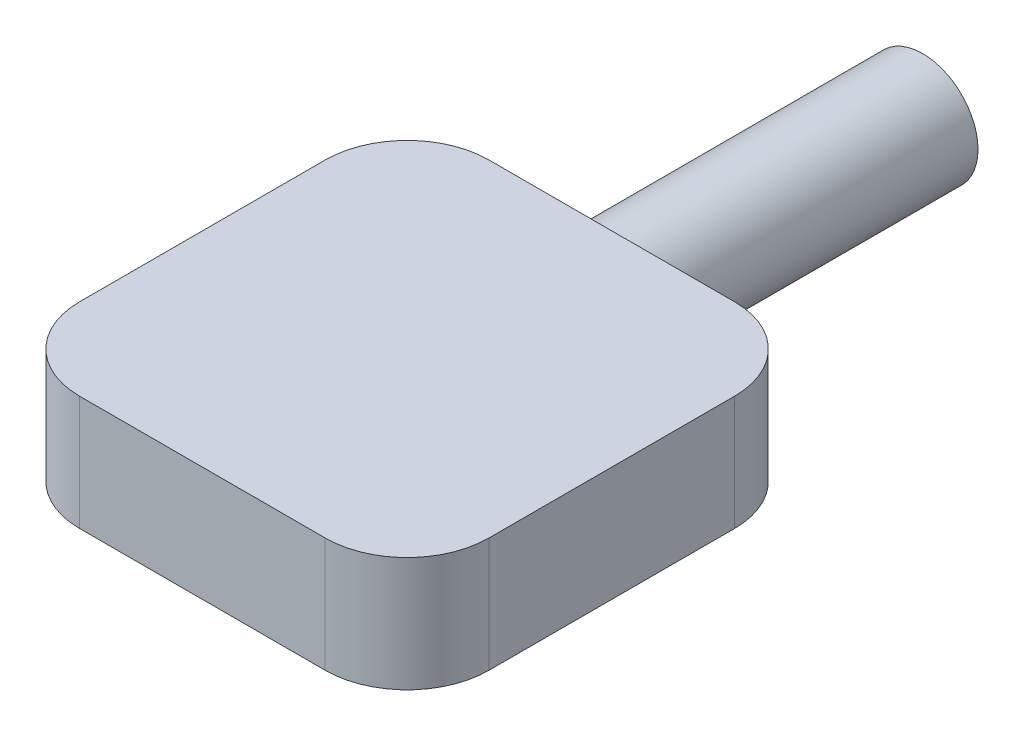
ISO-10303-21;
HEADER;
FILE_DESCRIPTION(('STEP AP214'),'2;1');
FILE_NAME('part.step','',(''),(''),'','','');
FILE_SCHEMA(('AUTOMOTIVE_DESIGN { 1 0 10303 214 1 1 1 1 }'));
ENDSEC;
DATA;
#1=APPLICATION_CONTEXT('core data for automotive mechanical design processes');
#2=APPLICATION_PROTOCOL_DEFINITION('international standard','automotive_design',2000,#1);
#3=PRODUCT_CONTEXT('',#1,'mechanical');
#4=PRODUCT('Part','Part','',(#3));
#5=PRODUCT_RELATED_PRODUCT_CATEGORY('part','',(#4));
#6=PRODUCT_DEFINITION_FORMATION('','',#4);
#7=PRODUCT_DEFINITION_CONTEXT('part definition',#1,'design');
#8=PRODUCT_DEFINITION('design','',#6,#7);
#9=PRODUCT_DEFINITION_SHAPE('','',#8);
#10=(LENGTH_UNIT() NAMED_UNIT(*) SI_UNIT(.MILLI.,.METRE.));
#11=(NAMED_UNIT(*) PLANE_ANGLE_UNIT() SI_UNIT($,.RADIAN.));
#12=(NAMED_UNIT(*) SI_UNIT($,.STERADIAN.) SOLID_ANGLE_UNIT());
#13=UNCERTAINTY_MEASURE_WITH_UNIT(LENGTH_MEASURE(1.E-05),#10,'distance_accuracy_value','');
#14=(GEOMETRIC_REPRESENTATION_CONTEXT(3) GLOBAL_UNCERTAINTY_ASSIGNED_CONTEXT((#13)) GLOBAL_UNIT_ASSIGNED_CONTEXT((#10,
#11,#12)) REPRESENTATION_CONTEXT('',''));
#15=CARTESIAN_POINT('',(0.,0.,0.));
#16=DIRECTION('',(0.,0.,1.));
#17=DIRECTION('',(1.,0.,0.));
#18=AXIS2_PLACEMENT_3D('',#15,#16,#17);
#19=CARTESIAN_POINT('',(0.,0.,-10.));
#20=DIRECTION('',(0.,0.,1.));
#21=DIRECTION('',(1.,0.,0.));
#22=AXIS2_PLACEMENT_3D('',#19,#20,#21);
#23=CYLINDRICAL_SURFACE('',#22,6.75);
#24=CARTESIAN_POINT('',(0.,0.,28.));
#25=DIRECTION('',(0.,0.,-1.));
#26=DIRECTION('',(-1.,0.,0.));
#27=AXIS2_PLACEMENT_3D('',#24,#25,#26);
#28=CIRCLE('',#27,6.75);
#29=CARTESIAN_POINT('',(-6.75,0.,28.));
#30=VERTEX_POINT('',#29);
#31=EDGE_CURVE('E11',#30,#30,#28,.F.);
#32=ORIENTED_EDGE('',*,*,#31,.F.);
#33=EDGE_LOOP('',(#32));
#34=FACE_BOUND('',#33,.T.);
#35=CARTESIAN_POINT('',(0.,0.,-10.));
#36=DIRECTION('',(0.,0.,1.));
#37=DIRECTION('',(1.,0.,0.));
#38=AXIS2_PLACEMENT_3D('',#35,#36,#37);
#39=CIRCLE('',#38,6.75);
#40=CARTESIAN_POINT('',(6.75,0.,-10.));
#41=VERTEX_POINT('',#40);
#42=EDGE_CURVE('E44',#41,#41,#39,.T.);
#43=ORIENTED_EDGE('',*,*,#42,.T.);
#44=EDGE_LOOP('',(#43));
#45=FACE_BOUND('',#44,.T.);
#46=ADVANCED_FACE('F37',(#34,#45),#23,.T.);
#47=CARTESIAN_POINT('',(0.,0.,-10.));
#48=DIRECTION('',(0.,0.,1.));
#49=DIRECTION('',(1.,0.,0.));
#50=AXIS2_PLACEMENT_3D('',#47,#48,#49);
#51=PLANE('',#50);
#52=ORIENTED_EDGE('',*,*,#42,.F.);
#53=EDGE_LOOP('',(#52));
#54=FACE_BOUND('',#53,.T.);
#55=ADVANCED_FACE('F171',(#54),#51,.F.);
#56=CARTESIAN_POINT('',(15.,-7.,38.));
#57=DIRECTION('',(0.,1.,0.));
#58=DIRECTION('',(0.,0.,1.));
#59=AXIS2_PLACEMENT_3D('',#56,#57,#58);
#60=CYLINDRICAL_SURFACE('',#59,10.);
#61=DIRECTION('',(0.,1.,0.));
#62=VECTOR('',#61,1.);
#63=CARTESIAN_POINT('',(15.,-7.,28.));
#64=LINE('',#63,#62);
#65=CARTESIAN_POINT('',(15.,-7.,28.));
#66=VERTEX_POINT('',#65);
#67=CARTESIAN_POINT('',(15.,7.,28.));
#68=VERTEX_POINT('',#67);
#69=EDGE_CURVE('E100',#66,#68,#64,.T.);
#70=ORIENTED_EDGE('',*,*,#69,.T.);
#71=CARTESIAN_POINT('',(15.,7.,38.));
#72=DIRECTION('',(0.,1.,0.));
#73=DIRECTION('',(0.,0.,-1.));
#74=AXIS2_PLACEMENT_3D('',#71,#72,#73);
#75=CIRCLE('',#74,10.);
#76=CARTESIAN_POINT('',(25.,7.,38.));
#77=VERTEX_POINT('',#76);
#78=EDGE_CURVE('E104',#77,#68,#75,.T.);
#79=ORIENTED_EDGE('',*,*,#78,.F.);
#80=DIRECTION('',(0.,1.,0.));
#81=VECTOR('',#80,1.);
#82=CARTESIAN_POINT('',(25.,-7.,38.));
#83=LINE('',#82,#81);
#84=CARTESIAN_POINT('',(25.,-7.,38.));
#85=VERTEX_POINT('',#84);
#86=EDGE_CURVE('E51',#85,#77,#83,.T.);
#87=ORIENTED_EDGE('',*,*,#86,.F.);
#88=CARTESIAN_POINT('',(15.,-7.,38.));
#89=DIRECTION('',(0.,1.,0.));
#90=DIRECTION('',(0.,0.,-1.));
#91=AXIS2_PLACEMENT_3D('',#88,#89,#90);
#92=CIRCLE('',#91,10.);
#93=EDGE_CURVE('E105',#85,#66,#92,.T.);
#94=ORIENTED_EDGE('',*,*,#93,.T.);
#95=EDGE_LOOP('',(#70,#79,#87,#94));
#96=FACE_BOUND('',#95,.T.);
#97=ADVANCED_FACE('F102',(#96),#60,.T.);
#98=CARTESIAN_POINT('',(25.,-7.,68.));
#99=DIRECTION('',(1.,0.,0.));
#100=DIRECTION('',(0.,0.,-1.));
#101=AXIS2_PLACEMENT_3D('',#98,#99,#100);
#102=PLANE('',#101);
#103=ORIENTED_EDGE('',*,*,#86,.T.);
#104=DIRECTION('',(0.,0.,-1.));
#105=VECTOR('',#104,1.);
#106=CARTESIAN_POINT('',(25.,7.,68.));
#107=LINE('',#106,#105);
#108=CARTESIAN_POINT('',(25.,7.,68.));
#109=VERTEX_POINT('',#108);
#110=EDGE_CURVE('E123',#109,#77,#107,.T.);
#111=ORIENTED_EDGE('',*,*,#110,.F.);
#112=DIRECTION('',(0.,1.,0.));
#113=VECTOR('',#112,1.);
#114=CARTESIAN_POINT('',(25.,-7.,68.));
#115=LINE('',#114,#113);
#116=CARTESIAN_POINT('',(25.,-7.,68.));
#117=VERTEX_POINT('',#116);
#118=EDGE_CURVE('E59',#117,#109,#115,.T.);
#119=ORIENTED_EDGE('',*,*,#118,.F.);
#120=DIRECTION('',(0.,0.,-1.));
#121=VECTOR('',#120,1.);
#122=CARTESIAN_POINT('',(25.,-7.,68.));
#123=LINE('',#122,#121);
#124=EDGE_CURVE('E110',#117,#85,#123,.T.);
#125=ORIENTED_EDGE('',*,*,#124,.T.);
#126=EDGE_LOOP('',(#103,#111,#119,#125));
#127=FACE_BOUND('',#126,.T.);
#128=ADVANCED_FACE('F177',(#127),#102,.T.);
#129=CARTESIAN_POINT('',(15.,-7.,68.));
#130=DIRECTION('',(0.,1.,0.));
#131=DIRECTION('',(0.,0.,1.));
#132=AXIS2_PLACEMENT_3D('',#129,#130,#131);
#133=CYLINDRICAL_SURFACE('',#132,10.);
#134=ORIENTED_EDGE('',*,*,#118,.T.);
#135=CARTESIAN_POINT('',(15.,7.,68.));
#136=DIRECTION('',(0.,1.,0.));
#137=DIRECTION('',(0.,0.,-1.));
#138=AXIS2_PLACEMENT_3D('',#135,#136,#137);
#139=CIRCLE('',#138,10.);
#140=CARTESIAN_POINT('',(15.,7.,78.));
#141=VERTEX_POINT('',#140);
#142=EDGE_CURVE('E136',#141,#109,#139,.T.);
#143=ORIENTED_EDGE('',*,*,#142,.F.);
#144=DIRECTION('',(0.,1.,0.));
#145=VECTOR('',#144,1.);
#146=CARTESIAN_POINT('',(15.,-7.,78.));
#147=LINE('',#146,#145);
#148=CARTESIAN_POINT('',(15.,-7.,78.));
#149=VERTEX_POINT('',#148);
#150=EDGE_CURVE('E159',#149,#141,#147,.T.);
#151=ORIENTED_EDGE('',*,*,#150,.F.);
#152=CARTESIAN_POINT('',(15.,-7.,68.));
#153=DIRECTION('',(0.,1.,0.));
#154=DIRECTION('',(0.,0.,-1.));
#155=AXIS2_PLACEMENT_3D('',#152,#153,#154);
#156=CIRCLE('',#155,10.);
#157=EDGE_CURVE('E154',#149,#117,#156,.T.);
#158=ORIENTED_EDGE('',*,*,#157,.T.);
#159=EDGE_LOOP('',(#134,#143,#151,#158));
#160=FACE_BOUND('',#159,.T.);
#161=ADVANCED_FACE('F200',(#160),#133,.T.);
#162=CARTESIAN_POINT('',(-15.,-7.,78.));
#163=DIRECTION('',(0.,0.,1.));
#164=DIRECTION('',(1.,0.,0.));
#165=AXIS2_PLACEMENT_3D('',#162,#163,#164);
#166=PLANE('',#165);
#167=ORIENTED_EDGE('',*,*,#150,.T.);
#168=DIRECTION('',(1.,0.,0.));
#169=VECTOR('',#168,1.);
#170=CARTESIAN_POINT('',(-15.,7.,78.));
#171=LINE('',#170,#169);
#172=CARTESIAN_POINT('',(-15.,7.,78.));
#173=VERTEX_POINT('',#172);
#174=EDGE_CURVE('E133',#173,#141,#171,.T.);
#175=ORIENTED_EDGE('',*,*,#174,.F.);
#176=DIRECTION('',(0.,1.,0.));
#177=VECTOR('',#176,1.);
#178=CARTESIAN_POINT('',(-15.,-7.,78.));
#179=LINE('',#178,#177);
#180=CARTESIAN_POINT('',(-15.,-7.,78.));
#181=VERTEX_POINT('',#180);
#182=EDGE_CURVE('E161',#181,#173,#179,.T.);
#183=ORIENTED_EDGE('',*,*,#182,.F.);
#184=DIRECTION('',(1.,0.,0.));
#185=VECTOR('',#184,1.);
#186=CARTESIAN_POINT('',(-15.,-7.,78.));
#187=LINE('',#186,#185);
#188=EDGE_CURVE('E151',#181,#149,#187,.T.);
#189=ORIENTED_EDGE('',*,*,#188,.T.);
#190=EDGE_LOOP('',(#167,#175,#183,#189));
#191=FACE_BOUND('',#190,.T.);
#192=ADVANCED_FACE('F196',(#191),#166,.T.);
#193=CARTESIAN_POINT('',(-15.,-7.,68.));
#194=DIRECTION('',(0.,1.,0.));
#195=DIRECTION('',(0.,0.,1.));
#196=AXIS2_PLACEMENT_3D('',#193,#194,#195);
#197=CYLINDRICAL_SURFACE('',#196,10.);
#198=ORIENTED_EDGE('',*,*,#182,.T.);
#199=CARTESIAN_POINT('',(-15.,7.,68.));
#200=DIRECTION('',(0.,1.,0.));
#201=DIRECTION('',(0.,0.,1.));
#202=AXIS2_PLACEMENT_3D('',#199,#200,#201);
#203=CIRCLE('',#202,10.);
#204=CARTESIAN_POINT('',(-25.,7.,68.));
#205=VERTEX_POINT('',#204);
#206=EDGE_CURVE('E130',#205,#173,#203,.T.);
#207=ORIENTED_EDGE('',*,*,#206,.F.);
#208=DIRECTION('',(0.,1.,0.));
#209=VECTOR('',#208,1.);
#210=CARTESIAN_POINT('',(-25.,-7.,68.));
#211=LINE('',#210,#209);
#212=CARTESIAN_POINT('',(-25.,-7.,68.));
#213=VERTEX_POINT('',#212);
#214=EDGE_CURVE('E163',#213,#205,#211,.T.);
#215=ORIENTED_EDGE('',*,*,#214,.F.);
#216=CARTESIAN_POINT('',(-15.,-7.,68.));
#217=DIRECTION('',(0.,1.,0.));
#218=DIRECTION('',(0.,0.,1.));
#219=AXIS2_PLACEMENT_3D('',#216,#217,#218);
#220=CIRCLE('',#219,10.);
#221=EDGE_CURVE('E148',#213,#181,#220,.T.);
#222=ORIENTED_EDGE('',*,*,#221,.T.);
#223=EDGE_LOOP('',(#198,#207,#215,#222));
#224=FACE_BOUND('',#223,.T.);
#225=ADVANCED_FACE('F192',(#224),#197,.T.);
#226=CARTESIAN_POINT('',(-25.,-7.,68.));
#227=DIRECTION('',(-1.,0.,0.));
#228=DIRECTION('',(0.,0.,1.));
#229=AXIS2_PLACEMENT_3D('',#226,#227,#228);
#230=PLANE('',#229);
#231=ORIENTED_EDGE('',*,*,#214,.T.);
#232=DIRECTION('',(0.,0.,1.));
#233=VECTOR('',#232,1.);
#234=CARTESIAN_POINT('',(-25.,7.,68.));
#235=LINE('',#234,#233);
#236=CARTESIAN_POINT('',(-25.,7.,38.));
#237=VERTEX_POINT('',#236);
#238=EDGE_CURVE('E127',#237,#205,#235,.T.);
#239=ORIENTED_EDGE('',*,*,#238,.F.);
#240=DIRECTION('',(0.,1.,0.));
#241=VECTOR('',#240,1.);
#242=CARTESIAN_POINT('',(-25.,-7.,38.));
#243=LINE('',#242,#241);
#244=CARTESIAN_POINT('',(-25.,-7.,38.));
#245=VERTEX_POINT('',#244);
#246=EDGE_CURVE('E165',#245,#237,#243,.T.);
#247=ORIENTED_EDGE('',*,*,#246,.F.);
#248=DIRECTION('',(0.,0.,1.));
#249=VECTOR('',#248,1.);
#250=CARTESIAN_POINT('',(-25.,-7.,68.));
#251=LINE('',#250,#249);
#252=EDGE_CURVE('E145',#245,#213,#251,.T.);
#253=ORIENTED_EDGE('',*,*,#252,.T.);
#254=EDGE_LOOP('',(#231,#239,#247,#253));
#255=FACE_BOUND('',#254,.T.);
#256=ADVANCED_FACE('F188',(#255),#230,.T.);
#257=CARTESIAN_POINT('',(-15.,-7.,38.));
#258=DIRECTION('',(0.,1.,0.));
#259=DIRECTION('',(0.,0.,1.));
#260=AXIS2_PLACEMENT_3D('',#257,#258,#259);
#261=CYLINDRICAL_SURFACE('',#260,10.);
#262=ORIENTED_EDGE('',*,*,#246,.T.);
#263=CARTESIAN_POINT('',(-15.,7.,38.));
#264=DIRECTION('',(0.,1.,0.));
#265=DIRECTION('',(0.,0.,-1.));
#266=AXIS2_PLACEMENT_3D('',#263,#264,#265);
#267=CIRCLE('',#266,10.);
#268=CARTESIAN_POINT('',(-15.,7.,28.));
#269=VERTEX_POINT('',#268);
#270=EDGE_CURVE('E118',#269,#237,#267,.T.);
#271=ORIENTED_EDGE('',*,*,#270,.F.);
#272=DIRECTION('',(0.,1.,0.));
#273=VECTOR('',#272,1.);
#274=CARTESIAN_POINT('',(-15.,-7.,28.));
#275=LINE('',#274,#273);
#276=CARTESIAN_POINT('',(-15.,-7.,28.));
#277=VERTEX_POINT('',#276);
#278=EDGE_CURVE('E109',#277,#269,#275,.T.);
#279=ORIENTED_EDGE('',*,*,#278,.F.);
#280=CARTESIAN_POINT('',(-15.,-7.,38.));
#281=DIRECTION('',(0.,1.,0.));
#282=DIRECTION('',(0.,0.,-1.));
#283=AXIS2_PLACEMENT_3D('',#280,#281,#282);
#284=CIRCLE('',#283,10.);
#285=EDGE_CURVE('E142',#277,#245,#284,.T.);
#286=ORIENTED_EDGE('',*,*,#285,.T.);
#287=EDGE_LOOP('',(#262,#271,#279,#286));
#288=FACE_BOUND('',#287,.T.);
#289=ADVANCED_FACE('F184',(#288),#261,.T.);
#290=CARTESIAN_POINT('',(-15.,-7.,28.));
#291=DIRECTION('',(0.,0.,-1.));
#292=DIRECTION('',(-1.,0.,0.));
#293=AXIS2_PLACEMENT_3D('',#290,#291,#292);
#294=PLANE('',#293);
#295=ORIENTED_EDGE('',*,*,#31,.T.);
#296=EDGE_LOOP('',(#295));
#297=FACE_BOUND('',#296,.T.);
#298=ORIENTED_EDGE('',*,*,#278,.T.);
#299=DIRECTION('',(-1.,0.,0.));
#300=VECTOR('',#299,1.);
#301=CARTESIAN_POINT('',(-15.,7.,28.));
#302=LINE('',#301,#300);
#303=EDGE_CURVE('E113',#68,#269,#302,.T.);
#304=ORIENTED_EDGE('',*,*,#303,.F.);
#305=ORIENTED_EDGE('',*,*,#69,.F.);
#306=DIRECTION('',(-1.,0.,0.));
#307=VECTOR('',#306,1.);
#308=CARTESIAN_POINT('',(-15.,-7.,28.));
#309=LINE('',#308,#307);
#310=EDGE_CURVE('E140',#66,#277,#309,.T.);
#311=ORIENTED_EDGE('',*,*,#310,.T.);
#312=EDGE_LOOP('',(#298,#304,#305,#311));
#313=FACE_BOUND('',#312,.T.);
#314=ADVANCED_FACE('F114',(#297,#313),#294,.T.);
#315=CARTESIAN_POINT('',(15.,-7.,38.));
#316=DIRECTION('',(0.,-1.,0.));
#317=DIRECTION('',(0.,0.,-1.));
#318=AXIS2_PLACEMENT_3D('',#315,#316,#317);
#319=PLANE('',#318);
#320=ORIENTED_EDGE('',*,*,#93,.F.);
#321=ORIENTED_EDGE('',*,*,#124,.F.);
#322=ORIENTED_EDGE('',*,*,#157,.F.);
#323=ORIENTED_EDGE('',*,*,#188,.F.);
#324=ORIENTED_EDGE('',*,*,#221,.F.);
#325=ORIENTED_EDGE('',*,*,#252,.F.);
#326=ORIENTED_EDGE('',*,*,#285,.F.);
#327=ORIENTED_EDGE('',*,*,#310,.F.);
#328=EDGE_LOOP('',(#320,#321,#322,#323,#324,#325,#326,#327));
#329=FACE_BOUND('',#328,.T.);
#330=ADVANCED_FACE('F183',(#329),#319,.T.);
#331=CARTESIAN_POINT('',(15.,7.,38.));
#332=DIRECTION('',(0.,-1.,0.));
#333=DIRECTION('',(0.,0.,-1.));
#334=AXIS2_PLACEMENT_3D('',#331,#332,#333);
#335=PLANE('',#334);
#336=ORIENTED_EDGE('',*,*,#78,.T.);
#337=ORIENTED_EDGE('',*,*,#303,.T.);
#338=ORIENTED_EDGE('',*,*,#270,.T.);
#339=ORIENTED_EDGE('',*,*,#238,.T.);
#340=ORIENTED_EDGE('',*,*,#206,.T.);
#341=ORIENTED_EDGE('',*,*,#174,.T.);
#342=ORIENTED_EDGE('',*,*,#142,.T.);
#343=ORIENTED_EDGE('',*,*,#110,.T.);
#344=EDGE_LOOP('',(#336,#337,#338,#339,#340,#341,#342,#343));
#345=FACE_BOUND('',#344,.T.);
#346=ADVANCED_FACE('F121',(#345),#335,.F.);
#347=CLOSED_SHELL('',(#46,#55,#97,#128,#161,#192,#225,#256,#289,#314,#330,#346));
#348=MANIFOLD_SOLID_BREP('B2',#347);
#349=ADVANCED_BREP_SHAPE_REPRESENTATION('',(#18,#348),#14);
#350=SHAPE_DEFINITION_REPRESENTATION(#9,#349);
ENDSEC;
END-ISO-10303-21;
